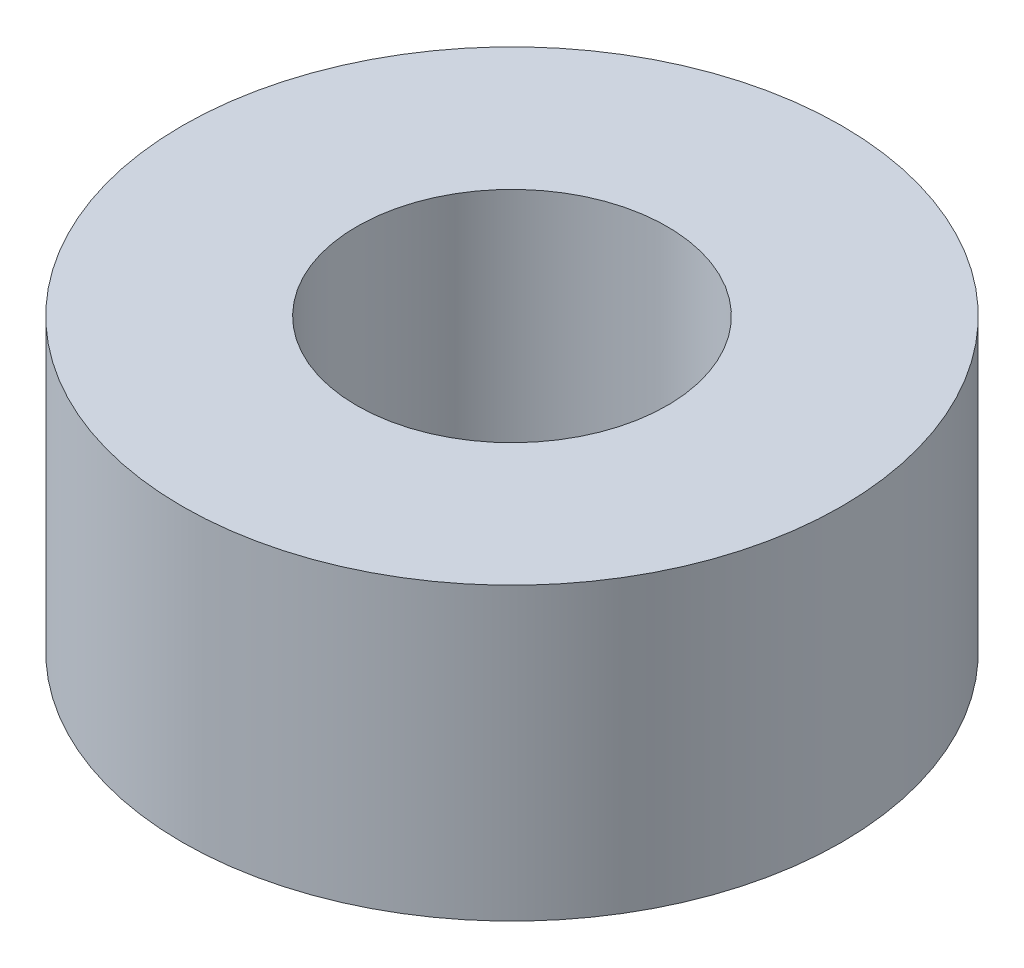
ISO-10303-21;
HEADER;
FILE_DESCRIPTION(('STEP AP214'),'2;1');
FILE_NAME('part.step','',(''),(''),'','','');
FILE_SCHEMA(('AUTOMOTIVE_DESIGN { 1 0 10303 214 1 1 1 1 }'));
ENDSEC;
DATA;
#1=APPLICATION_CONTEXT('core data for automotive mechanical design processes');
#2=APPLICATION_PROTOCOL_DEFINITION('international standard','automotive_design',2000,#1);
#3=PRODUCT_CONTEXT('',#1,'mechanical');
#4=PRODUCT('Part','Part','',(#3));
#5=PRODUCT_RELATED_PRODUCT_CATEGORY('part','',(#4));
#6=PRODUCT_DEFINITION_FORMATION('','',#4);
#7=PRODUCT_DEFINITION_CONTEXT('part definition',#1,'design');
#8=PRODUCT_DEFINITION('design','',#6,#7);
#9=PRODUCT_DEFINITION_SHAPE('','',#8);
#10=(LENGTH_UNIT() NAMED_UNIT(*) SI_UNIT(.MILLI.,.METRE.));
#11=(NAMED_UNIT(*) PLANE_ANGLE_UNIT() SI_UNIT($,.RADIAN.));
#12=(NAMED_UNIT(*) SI_UNIT($,.STERADIAN.) SOLID_ANGLE_UNIT());
#13=UNCERTAINTY_MEASURE_WITH_UNIT(LENGTH_MEASURE(1.E-05),#10,'distance_accuracy_value','');
#14=(GEOMETRIC_REPRESENTATION_CONTEXT(3) GLOBAL_UNCERTAINTY_ASSIGNED_CONTEXT((#13)) GLOBAL_UNIT_ASSIGNED_CONTEXT((#10,
#11,#12)) REPRESENTATION_CONTEXT('',''));
#15=CARTESIAN_POINT('',(0.,0.,0.));
#16=DIRECTION('',(0.,0.,1.));
#17=DIRECTION('',(1.,0.,0.));
#18=AXIS2_PLACEMENT_3D('',#15,#16,#17);
#19=CARTESIAN_POINT('',(0.,3.,0.));
#20=DIRECTION('',(0.,1.,0.));
#21=DIRECTION('',(0.,0.,1.));
#22=AXIS2_PLACEMENT_3D('',#19,#20,#21);
#23=PLANE('',#22);
#24=CARTESIAN_POINT('',(0.,3.,0.));
#25=DIRECTION('',(0.,1.,0.));
#26=DIRECTION('',(0.,0.,1.));
#27=AXIS2_PLACEMENT_3D('',#24,#25,#26);
#28=CIRCLE('',#27,3.4);
#29=CARTESIAN_POINT('',(0.,3.,3.4));
#30=VERTEX_POINT('',#29);
#31=EDGE_CURVE('E10',#30,#30,#28,.T.);
#32=ORIENTED_EDGE('',*,*,#31,.T.);
#33=EDGE_LOOP('',(#32));
#34=FACE_BOUND('',#33,.T.);
#35=CARTESIAN_POINT('',(0.,3.,0.));
#36=DIRECTION('',(0.,1.,0.));
#37=DIRECTION('',(0.,0.,1.));
#38=AXIS2_PLACEMENT_3D('',#35,#36,#37);
#39=CIRCLE('',#38,1.6);
#40=CARTESIAN_POINT('',(0.,3.,1.6));
#41=VERTEX_POINT('',#40);
#42=EDGE_CURVE('E21',#41,#41,#39,.T.);
#43=ORIENTED_EDGE('',*,*,#42,.F.);
#44=EDGE_LOOP('',(#43));
#45=FACE_BOUND('',#44,.T.);
#46=ADVANCED_FACE('F15',(#34,#45),#23,.T.);
#47=CARTESIAN_POINT('',(0.,0.,0.));
#48=DIRECTION('',(0.,1.,0.));
#49=DIRECTION('',(0.,0.,1.));
#50=AXIS2_PLACEMENT_3D('',#47,#48,#49);
#51=PLANE('',#50);
#52=CARTESIAN_POINT('',(0.,0.,0.));
#53=DIRECTION('',(0.,1.,0.));
#54=DIRECTION('',(0.,0.,1.));
#55=AXIS2_PLACEMENT_3D('',#52,#53,#54);
#56=CIRCLE('',#55,3.4);
#57=CARTESIAN_POINT('',(0.,0.,3.4));
#58=VERTEX_POINT('',#57);
#59=EDGE_CURVE('E25',#58,#58,#56,.T.);
#60=ORIENTED_EDGE('',*,*,#59,.F.);
#61=EDGE_LOOP('',(#60));
#62=FACE_BOUND('',#61,.T.);
#63=CARTESIAN_POINT('',(0.,0.,0.));
#64=DIRECTION('',(0.,1.,0.));
#65=DIRECTION('',(0.,0.,1.));
#66=AXIS2_PLACEMENT_3D('',#63,#64,#65);
#67=CIRCLE('',#66,1.6);
#68=CARTESIAN_POINT('',(0.,0.,1.6));
#69=VERTEX_POINT('',#68);
#70=EDGE_CURVE('E29',#69,#69,#67,.T.);
#71=ORIENTED_EDGE('',*,*,#70,.T.);
#72=EDGE_LOOP('',(#71));
#73=FACE_BOUND('',#72,.T.);
#74=ADVANCED_FACE('F35',(#62,#73),#51,.F.);
#75=CARTESIAN_POINT('',(0.,3.,0.));
#76=DIRECTION('',(0.,-1.,0.));
#77=DIRECTION('',(0.,0.,-1.));
#78=AXIS2_PLACEMENT_3D('',#75,#76,#77);
#79=CYLINDRICAL_SURFACE('',#78,3.4);
#80=ORIENTED_EDGE('',*,*,#31,.F.);
#81=EDGE_LOOP('',(#80));
#82=FACE_BOUND('',#81,.T.);
#83=ORIENTED_EDGE('',*,*,#59,.T.);
#84=EDGE_LOOP('',(#83));
#85=FACE_BOUND('',#84,.T.);
#86=ADVANCED_FACE('F39',(#82,#85),#79,.T.);
#87=CARTESIAN_POINT('',(0.,3.,0.));
#88=DIRECTION('',(0.,-1.,0.));
#89=DIRECTION('',(0.,0.,-1.));
#90=AXIS2_PLACEMENT_3D('',#87,#88,#89);
#91=CYLINDRICAL_SURFACE('',#90,1.6);
#92=ORIENTED_EDGE('',*,*,#42,.T.);
#93=EDGE_LOOP('',(#92));
#94=FACE_BOUND('',#93,.T.);
#95=ORIENTED_EDGE('',*,*,#70,.F.);
#96=EDGE_LOOP('',(#95));
#97=FACE_BOUND('',#96,.T.);
#98=ADVANCED_FACE('F37',(#94,#97),#91,.F.);
#99=CLOSED_SHELL('',(#46,#74,#86,#98));
#100=MANIFOLD_SOLID_BREP('B1',#99);
#101=ADVANCED_BREP_SHAPE_REPRESENTATION('',(#18,#100),#14);
#102=SHAPE_DEFINITION_REPRESENTATION(#9,#101);
ENDSEC;
END-ISO-10303-21;
